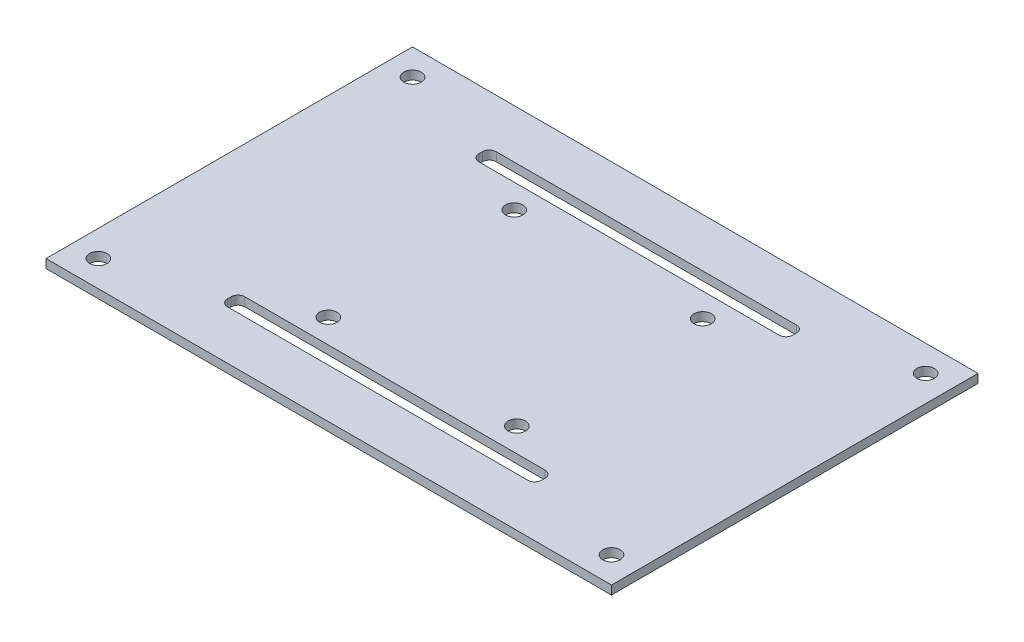
ISO-10303-21;
HEADER;
FILE_DESCRIPTION(('STEP AP214'),'2;1');
FILE_NAME('part.step','',(''),(''),'','','');
FILE_SCHEMA(('AUTOMOTIVE_DESIGN { 1 0 10303 214 1 1 1 1 }'));
ENDSEC;
DATA;
#1=APPLICATION_CONTEXT('core data for automotive mechanical design processes');
#2=APPLICATION_PROTOCOL_DEFINITION('international standard','automotive_design',2000,#1);
#3=PRODUCT_CONTEXT('',#1,'mechanical');
#4=PRODUCT('Part','Part','',(#3));
#5=PRODUCT_RELATED_PRODUCT_CATEGORY('part','',(#4));
#6=PRODUCT_DEFINITION_FORMATION('','',#4);
#7=PRODUCT_DEFINITION_CONTEXT('part definition',#1,'design');
#8=PRODUCT_DEFINITION('design','',#6,#7);
#9=PRODUCT_DEFINITION_SHAPE('','',#8);
#10=(LENGTH_UNIT() NAMED_UNIT(*) SI_UNIT(.MILLI.,.METRE.));
#11=(NAMED_UNIT(*) PLANE_ANGLE_UNIT() SI_UNIT($,.RADIAN.));
#12=(NAMED_UNIT(*) SI_UNIT($,.STERADIAN.) SOLID_ANGLE_UNIT());
#13=UNCERTAINTY_MEASURE_WITH_UNIT(LENGTH_MEASURE(1.E-05),#10,'distance_accuracy_value','');
#14=(GEOMETRIC_REPRESENTATION_CONTEXT(3) GLOBAL_UNCERTAINTY_ASSIGNED_CONTEXT((#13)) GLOBAL_UNIT_ASSIGNED_CONTEXT((#10,
#11,#12)) REPRESENTATION_CONTEXT('',''));
#15=CARTESIAN_POINT('',(0.,0.,0.));
#16=DIRECTION('',(0.,0.,1.));
#17=DIRECTION('',(1.,0.,0.));
#18=AXIS2_PLACEMENT_3D('',#15,#16,#17);
#19=CARTESIAN_POINT('',(-102.87,3.175,66.675));
#20=DIRECTION('',(-1.,0.,0.));
#21=DIRECTION('',(0.,0.,1.));
#22=AXIS2_PLACEMENT_3D('',#19,#20,#21);
#23=PLANE('',#22);
#24=DIRECTION('',(0.,0.,-1.));
#25=VECTOR('',#24,1.);
#26=CARTESIAN_POINT('',(-102.87,0.,66.675));
#27=LINE('',#26,#25);
#28=CARTESIAN_POINT('',(-102.87,0.,66.675));
#29=VERTEX_POINT('',#28);
#30=CARTESIAN_POINT('',(-102.87,0.,-66.675));
#31=VERTEX_POINT('',#30);
#32=EDGE_CURVE('E434',#29,#31,#27,.T.);
#33=ORIENTED_EDGE('',*,*,#32,.F.);
#34=DIRECTION('',(0.,-1.,0.));
#35=VECTOR('',#34,1.);
#36=CARTESIAN_POINT('',(-102.87,3.175,66.675));
#37=LINE('',#36,#35);
#38=CARTESIAN_POINT('',(-102.87,3.175,66.675));
#39=VERTEX_POINT('',#38);
#40=EDGE_CURVE('E11',#39,#29,#37,.T.);
#41=ORIENTED_EDGE('',*,*,#40,.F.);
#42=DIRECTION('',(0.,0.,-1.));
#43=VECTOR('',#42,1.);
#44=CARTESIAN_POINT('',(-102.87,3.175,66.675));
#45=LINE('',#44,#43);
#46=CARTESIAN_POINT('',(-102.87,3.175,-66.675));
#47=VERTEX_POINT('',#46);
#48=EDGE_CURVE('E438',#39,#47,#45,.T.);
#49=ORIENTED_EDGE('',*,*,#48,.T.);
#50=DIRECTION('',(0.,-1.,0.));
#51=VECTOR('',#50,1.);
#52=CARTESIAN_POINT('',(-102.87,3.175,-66.675));
#53=LINE('',#52,#51);
#54=EDGE_CURVE('E56',#47,#31,#53,.T.);
#55=ORIENTED_EDGE('',*,*,#54,.T.);
#56=EDGE_LOOP('',(#33,#41,#49,#55));
#57=FACE_BOUND('',#56,.T.);
#58=ADVANCED_FACE('F53',(#57),#23,.T.);
#59=CARTESIAN_POINT('',(-102.87,3.175,66.675));
#60=DIRECTION('',(0.,0.,-1.));
#61=DIRECTION('',(-1.,0.,0.));
#62=AXIS2_PLACEMENT_3D('',#59,#60,#61);
#63=PLANE('',#62);
#64=DIRECTION('',(1.,0.,0.));
#65=VECTOR('',#64,1.);
#66=CARTESIAN_POINT('',(-102.87,0.,66.675));
#67=LINE('',#66,#65);
#68=CARTESIAN_POINT('',(102.87,0.,66.675));
#69=VERTEX_POINT('',#68);
#70=EDGE_CURVE('E443',#29,#69,#67,.T.);
#71=ORIENTED_EDGE('',*,*,#70,.T.);
#72=DIRECTION('',(0.,-1.,0.));
#73=VECTOR('',#72,1.);
#74=CARTESIAN_POINT('',(102.87,3.175,66.675));
#75=LINE('',#74,#73);
#76=CARTESIAN_POINT('',(102.87,3.175,66.675));
#77=VERTEX_POINT('',#76);
#78=EDGE_CURVE('E62',#77,#69,#75,.T.);
#79=ORIENTED_EDGE('',*,*,#78,.F.);
#80=DIRECTION('',(1.,0.,0.));
#81=VECTOR('',#80,1.);
#82=CARTESIAN_POINT('',(-102.87,3.175,66.675));
#83=LINE('',#82,#81);
#84=EDGE_CURVE('E450',#39,#77,#83,.T.);
#85=ORIENTED_EDGE('',*,*,#84,.F.);
#86=ORIENTED_EDGE('',*,*,#40,.T.);
#87=EDGE_LOOP('',(#71,#79,#85,#86));
#88=FACE_BOUND('',#87,.T.);
#89=ADVANCED_FACE('F486',(#88),#63,.F.);
#90=CARTESIAN_POINT('',(102.87,3.175,66.675));
#91=DIRECTION('',(-1.,0.,0.));
#92=DIRECTION('',(0.,0.,1.));
#93=AXIS2_PLACEMENT_3D('',#90,#91,#92);
#94=PLANE('',#93);
#95=DIRECTION('',(0.,0.,-1.));
#96=VECTOR('',#95,1.);
#97=CARTESIAN_POINT('',(102.87,0.,66.675));
#98=LINE('',#97,#96);
#99=CARTESIAN_POINT('',(102.87,0.,-66.675));
#100=VERTEX_POINT('',#99);
#101=EDGE_CURVE('E460',#69,#100,#98,.T.);
#102=ORIENTED_EDGE('',*,*,#101,.T.);
#103=DIRECTION('',(0.,-1.,0.));
#104=VECTOR('',#103,1.);
#105=CARTESIAN_POINT('',(102.87,3.175,-66.675));
#106=LINE('',#105,#104);
#107=CARTESIAN_POINT('',(102.87,3.175,-66.675));
#108=VERTEX_POINT('',#107);
#109=EDGE_CURVE('E468',#108,#100,#106,.T.);
#110=ORIENTED_EDGE('',*,*,#109,.F.);
#111=DIRECTION('',(0.,0.,-1.));
#112=VECTOR('',#111,1.);
#113=CARTESIAN_POINT('',(102.87,3.175,66.675));
#114=LINE('',#113,#112);
#115=EDGE_CURVE('E447',#77,#108,#114,.T.);
#116=ORIENTED_EDGE('',*,*,#115,.F.);
#117=ORIENTED_EDGE('',*,*,#78,.T.);
#118=EDGE_LOOP('',(#102,#110,#116,#117));
#119=FACE_BOUND('',#118,.T.);
#120=ADVANCED_FACE('F490',(#119),#94,.F.);
#121=CARTESIAN_POINT('',(-102.87,3.175,-66.675));
#122=DIRECTION('',(0.,0.,-1.));
#123=DIRECTION('',(-1.,0.,0.));
#124=AXIS2_PLACEMENT_3D('',#121,#122,#123);
#125=PLANE('',#124);
#126=DIRECTION('',(1.,0.,0.));
#127=VECTOR('',#126,1.);
#128=CARTESIAN_POINT('',(-102.87,0.,-66.675));
#129=LINE('',#128,#127);
#130=EDGE_CURVE('E456',#31,#100,#129,.T.);
#131=ORIENTED_EDGE('',*,*,#130,.F.);
#132=ORIENTED_EDGE('',*,*,#54,.F.);
#133=DIRECTION('',(1.,0.,0.));
#134=VECTOR('',#133,1.);
#135=CARTESIAN_POINT('',(-102.87,3.175,-66.675));
#136=LINE('',#135,#134);
#137=EDGE_CURVE('E442',#47,#108,#136,.T.);
#138=ORIENTED_EDGE('',*,*,#137,.T.);
#139=ORIENTED_EDGE('',*,*,#109,.T.);
#140=EDGE_LOOP('',(#131,#132,#138,#139));
#141=FACE_BOUND('',#140,.T.);
#142=ADVANCED_FACE('F480',(#141),#125,.T.);
#143=CARTESIAN_POINT('',(0.,3.175,0.));
#144=DIRECTION('',(0.,-1.,0.));
#145=DIRECTION('',(0.,0.,-1.));
#146=AXIS2_PLACEMENT_3D('',#143,#144,#145);
#147=PLANE('',#146);
#148=DIRECTION('',(-1.,0.,0.));
#149=VECTOR('',#148,1.);
#150=CARTESIAN_POINT('',(-54.61,3.175,42.545));
#151=LINE('',#150,#149);
#152=CARTESIAN_POINT('',(54.61,3.175,42.545));
#153=VERTEX_POINT('',#152);
#154=CARTESIAN_POINT('',(-54.61,3.175,42.545));
#155=VERTEX_POINT('',#154);
#156=EDGE_CURVE('E245',#153,#155,#151,.T.);
#157=ORIENTED_EDGE('',*,*,#156,.F.);
#158=CARTESIAN_POINT('',(54.61,3.175,45.085));
#159=DIRECTION('',(0.,1.,0.));
#160=DIRECTION('',(0.,0.,-1.));
#161=AXIS2_PLACEMENT_3D('',#158,#159,#160);
#162=CIRCLE('',#161,2.54);
#163=CARTESIAN_POINT('',(57.15,3.175,45.085));
#164=VERTEX_POINT('',#163);
#165=EDGE_CURVE('E70',#164,#153,#162,.T.);
#166=ORIENTED_EDGE('',*,*,#165,.F.);
#167=DIRECTION('',(0.,0.,-1.));
#168=VECTOR('',#167,1.);
#169=CARTESIAN_POINT('',(57.15,3.175,45.085));
#170=LINE('',#169,#168);
#171=CARTESIAN_POINT('',(57.15,3.175,46.355));
#172=VERTEX_POINT('',#171);
#173=EDGE_CURVE('E216',#172,#164,#170,.T.);
#174=ORIENTED_EDGE('',*,*,#173,.F.);
#175=CARTESIAN_POINT('',(54.61,3.175,46.355));
#176=DIRECTION('',(0.,1.,0.));
#177=DIRECTION('',(0.,0.,1.));
#178=AXIS2_PLACEMENT_3D('',#175,#176,#177);
#179=CIRCLE('',#178,2.54);
#180=CARTESIAN_POINT('',(54.61,3.175,48.895));
#181=VERTEX_POINT('',#180);
#182=EDGE_CURVE('E221',#181,#172,#179,.T.);
#183=ORIENTED_EDGE('',*,*,#182,.F.);
#184=DIRECTION('',(1.,0.,0.));
#185=VECTOR('',#184,1.);
#186=CARTESIAN_POINT('',(-54.61,3.175,48.895));
#187=LINE('',#186,#185);
#188=CARTESIAN_POINT('',(-54.61,3.175,48.895));
#189=VERTEX_POINT('',#188);
#190=EDGE_CURVE('E260',#189,#181,#187,.T.);
#191=ORIENTED_EDGE('',*,*,#190,.F.);
#192=CARTESIAN_POINT('',(-54.61,3.175,46.355));
#193=DIRECTION('',(0.,1.,0.));
#194=DIRECTION('',(0.,0.,1.));
#195=AXIS2_PLACEMENT_3D('',#192,#193,#194);
#196=CIRCLE('',#195,2.54);
#197=CARTESIAN_POINT('',(-57.15,3.175,46.355));
#198=VERTEX_POINT('',#197);
#199=EDGE_CURVE('E256',#198,#189,#196,.T.);
#200=ORIENTED_EDGE('',*,*,#199,.F.);
#201=DIRECTION('',(0.,0.,1.));
#202=VECTOR('',#201,1.);
#203=CARTESIAN_POINT('',(-57.15,3.175,45.085));
#204=LINE('',#203,#202);
#205=CARTESIAN_POINT('',(-57.15,3.175,45.085));
#206=VERTEX_POINT('',#205);
#207=EDGE_CURVE('E252',#206,#198,#204,.T.);
#208=ORIENTED_EDGE('',*,*,#207,.F.);
#209=CARTESIAN_POINT('',(-54.61,3.175,45.085));
#210=DIRECTION('',(0.,1.,0.));
#211=DIRECTION('',(0.,0.,1.));
#212=AXIS2_PLACEMENT_3D('',#209,#210,#211);
#213=CIRCLE('',#212,2.54);
#214=EDGE_CURVE('E248',#155,#206,#213,.T.);
#215=ORIENTED_EDGE('',*,*,#214,.F.);
#216=EDGE_LOOP('',(#157,#166,#174,#183,#191,#200,#208,#215));
#217=FACE_BOUND('',#216,.T.);
#218=DIRECTION('',(1.,0.,0.));
#219=VECTOR('',#218,1.);
#220=CARTESIAN_POINT('',(-54.61,3.175,-42.545));
#221=LINE('',#220,#219);
#222=CARTESIAN_POINT('',(-54.61,3.175,-42.545));
#223=VERTEX_POINT('',#222);
#224=CARTESIAN_POINT('',(54.61,3.175,-42.545));
#225=VERTEX_POINT('',#224);
#226=EDGE_CURVE('E338',#223,#225,#221,.T.);
#227=ORIENTED_EDGE('',*,*,#226,.F.);
#228=CARTESIAN_POINT('',(-54.61,3.175,-45.085));
#229=DIRECTION('',(0.,1.,0.));
#230=DIRECTION('',(0.,0.,-1.));
#231=AXIS2_PLACEMENT_3D('',#228,#229,#230);
#232=CIRCLE('',#231,2.54);
#233=CARTESIAN_POINT('',(-57.15,3.175,-45.085));
#234=VERTEX_POINT('',#233);
#235=EDGE_CURVE('E78',#234,#223,#232,.T.);
#236=ORIENTED_EDGE('',*,*,#235,.F.);
#237=DIRECTION('',(0.,0.,1.));
#238=VECTOR('',#237,1.);
#239=CARTESIAN_POINT('',(-57.15,3.175,-45.085));
#240=LINE('',#239,#238);
#241=CARTESIAN_POINT('',(-57.15,3.175,-46.355));
#242=VERTEX_POINT('',#241);
#243=EDGE_CURVE('E313',#242,#234,#240,.T.);
#244=ORIENTED_EDGE('',*,*,#243,.F.);
#245=CARTESIAN_POINT('',(-54.61,3.175,-46.355));
#246=DIRECTION('',(0.,1.,0.));
#247=DIRECTION('',(0.,0.,-1.));
#248=AXIS2_PLACEMENT_3D('',#245,#246,#247);
#249=CIRCLE('',#248,2.54);
#250=CARTESIAN_POINT('',(-54.61,3.175,-48.895));
#251=VERTEX_POINT('',#250);
#252=EDGE_CURVE('E317',#251,#242,#249,.T.);
#253=ORIENTED_EDGE('',*,*,#252,.F.);
#254=DIRECTION('',(-1.,0.,0.));
#255=VECTOR('',#254,1.);
#256=CARTESIAN_POINT('',(-54.61,3.175,-48.895));
#257=LINE('',#256,#255);
#258=CARTESIAN_POINT('',(54.61,3.175,-48.895));
#259=VERTEX_POINT('',#258);
#260=EDGE_CURVE('E322',#259,#251,#257,.T.);
#261=ORIENTED_EDGE('',*,*,#260,.F.);
#262=CARTESIAN_POINT('',(54.61,3.175,-46.355));
#263=DIRECTION('',(0.,1.,0.));
#264=DIRECTION('',(0.,0.,-1.));
#265=AXIS2_PLACEMENT_3D('',#262,#263,#264);
#266=CIRCLE('',#265,2.54);
#267=CARTESIAN_POINT('',(57.15,3.175,-46.355));
#268=VERTEX_POINT('',#267);
#269=EDGE_CURVE('E326',#268,#259,#266,.T.);
#270=ORIENTED_EDGE('',*,*,#269,.F.);
#271=DIRECTION('',(0.,0.,-1.));
#272=VECTOR('',#271,1.);
#273=CARTESIAN_POINT('',(57.15,3.175,-45.085));
#274=LINE('',#273,#272);
#275=CARTESIAN_POINT('',(57.15,3.175,-45.085));
#276=VERTEX_POINT('',#275);
#277=EDGE_CURVE('E330',#276,#268,#274,.T.);
#278=ORIENTED_EDGE('',*,*,#277,.F.);
#279=CARTESIAN_POINT('',(54.61,3.175,-45.085));
#280=DIRECTION('',(0.,1.,0.));
#281=DIRECTION('',(0.,0.,1.));
#282=AXIS2_PLACEMENT_3D('',#279,#280,#281);
#283=CIRCLE('',#282,2.54);
#284=EDGE_CURVE('E334',#225,#276,#283,.T.);
#285=ORIENTED_EDGE('',*,*,#284,.F.);
#286=EDGE_LOOP('',(#227,#236,#244,#253,#261,#270,#278,#285));
#287=FACE_BOUND('',#286,.T.);
#288=CARTESIAN_POINT('',(-93.345,3.175,57.15));
#289=DIRECTION('',(0.,1.,0.));
#290=DIRECTION('',(0.,0.,-1.));
#291=AXIS2_PLACEMENT_3D('',#288,#289,#290);
#292=CIRCLE('',#291,3.175);
#293=CARTESIAN_POINT('',(-93.345,3.175,53.975));
#294=VERTEX_POINT('',#293);
#295=EDGE_CURVE('E391',#294,#294,#292,.T.);
#296=ORIENTED_EDGE('',*,*,#295,.F.);
#297=EDGE_LOOP('',(#296));
#298=FACE_BOUND('',#297,.T.);
#299=CARTESIAN_POINT('',(93.345,3.175,57.15));
#300=DIRECTION('',(0.,1.,0.));
#301=DIRECTION('',(0.,0.,-1.));
#302=AXIS2_PLACEMENT_3D('',#299,#300,#301);
#303=CIRCLE('',#302,3.175);
#304=CARTESIAN_POINT('',(93.345,3.175,53.975));
#305=VERTEX_POINT('',#304);
#306=EDGE_CURVE('E383',#305,#305,#303,.T.);
#307=ORIENTED_EDGE('',*,*,#306,.F.);
#308=EDGE_LOOP('',(#307));
#309=FACE_BOUND('',#308,.T.);
#310=CARTESIAN_POINT('',(93.345,3.175,-57.15));
#311=DIRECTION('',(0.,1.,0.));
#312=DIRECTION('',(0.,0.,1.));
#313=AXIS2_PLACEMENT_3D('',#310,#311,#312);
#314=CIRCLE('',#313,3.175);
#315=CARTESIAN_POINT('',(93.345,3.175,-53.975));
#316=VERTEX_POINT('',#315);
#317=EDGE_CURVE('E374',#316,#316,#314,.T.);
#318=ORIENTED_EDGE('',*,*,#317,.F.);
#319=EDGE_LOOP('',(#318));
#320=FACE_BOUND('',#319,.T.);
#321=CARTESIAN_POINT('',(-93.345,3.175,-57.15));
#322=DIRECTION('',(0.,1.,0.));
#323=DIRECTION('',(0.,0.,1.));
#324=AXIS2_PLACEMENT_3D('',#321,#322,#323);
#325=CIRCLE('',#324,3.175);
#326=CARTESIAN_POINT('',(-93.345,3.175,-53.975));
#327=VERTEX_POINT('',#326);
#328=EDGE_CURVE('E378',#327,#327,#325,.T.);
#329=ORIENTED_EDGE('',*,*,#328,.F.);
#330=EDGE_LOOP('',(#329));
#331=FACE_BOUND('',#330,.T.);
#332=CARTESIAN_POINT('',(-33.02,3.175,-33.812500066));
#333=DIRECTION('',(0.,1.,0.));
#334=DIRECTION('',(0.,0.,1.));
#335=AXIS2_PLACEMENT_3D('',#332,#333,#334);
#336=CIRCLE('',#335,3.175);
#337=CARTESIAN_POINT('',(-33.02,3.175,-30.637500066));
#338=VERTEX_POINT('',#337);
#339=EDGE_CURVE('E423',#338,#338,#336,.T.);
#340=ORIENTED_EDGE('',*,*,#339,.F.);
#341=EDGE_LOOP('',(#340));
#342=FACE_BOUND('',#341,.T.);
#343=CARTESIAN_POINT('',(35.56,3.175,-33.812500066));
#344=DIRECTION('',(0.,1.,0.));
#345=DIRECTION('',(0.,0.,1.));
#346=AXIS2_PLACEMENT_3D('',#343,#344,#345);
#347=CIRCLE('',#346,3.175);
#348=CARTESIAN_POINT('',(35.56,3.175,-30.637500066));
#349=VERTEX_POINT('',#348);
#350=EDGE_CURVE('E415',#349,#349,#347,.T.);
#351=ORIENTED_EDGE('',*,*,#350,.F.);
#352=EDGE_LOOP('',(#351));
#353=FACE_BOUND('',#352,.T.);
#354=CARTESIAN_POINT('',(35.56,3.175,33.812500066));
#355=DIRECTION('',(0.,1.,0.));
#356=DIRECTION('',(0.,0.,1.));
#357=AXIS2_PLACEMENT_3D('',#354,#355,#356);
#358=CIRCLE('',#357,3.175);
#359=CARTESIAN_POINT('',(35.56,3.175,36.987500066));
#360=VERTEX_POINT('',#359);
#361=EDGE_CURVE('E406',#360,#360,#358,.T.);
#362=ORIENTED_EDGE('',*,*,#361,.F.);
#363=EDGE_LOOP('',(#362));
#364=FACE_BOUND('',#363,.T.);
#365=CARTESIAN_POINT('',(-33.02,3.175,33.812500066));
#366=DIRECTION('',(0.,1.,0.));
#367=DIRECTION('',(0.,0.,1.));
#368=AXIS2_PLACEMENT_3D('',#365,#366,#367);
#369=CIRCLE('',#368,3.175);
#370=CARTESIAN_POINT('',(-33.02,3.175,36.987500066));
#371=VERTEX_POINT('',#370);
#372=EDGE_CURVE('E410',#371,#371,#369,.T.);
#373=ORIENTED_EDGE('',*,*,#372,.F.);
#374=EDGE_LOOP('',(#373));
#375=FACE_BOUND('',#374,.T.);
#376=ORIENTED_EDGE('',*,*,#48,.F.);
#377=ORIENTED_EDGE('',*,*,#84,.T.);
#378=ORIENTED_EDGE('',*,*,#115,.T.);
#379=ORIENTED_EDGE('',*,*,#137,.F.);
#380=EDGE_LOOP('',(#376,#377,#378,#379));
#381=FACE_BOUND('',#380,.T.);
#382=ADVANCED_FACE('F492',(#217,#287,#298,#309,#320,#331,#342,#353,#364,#375,#381),#147,.F.);
#383=CARTESIAN_POINT('',(0.,0.,0.));
#384=DIRECTION('',(0.,-1.,0.));
#385=DIRECTION('',(0.,0.,-1.));
#386=AXIS2_PLACEMENT_3D('',#383,#384,#385);
#387=PLANE('',#386);
#388=CARTESIAN_POINT('',(54.61,0.,45.085));
#389=DIRECTION('',(0.,1.,0.));
#390=DIRECTION('',(0.,0.,-1.));
#391=AXIS2_PLACEMENT_3D('',#388,#389,#390);
#392=CIRCLE('',#391,2.54);
#393=CARTESIAN_POINT('',(57.15,0.,45.085));
#394=VERTEX_POINT('',#393);
#395=CARTESIAN_POINT('',(54.61,0.,42.545));
#396=VERTEX_POINT('',#395);
#397=EDGE_CURVE('E193',#394,#396,#392,.T.);
#398=ORIENTED_EDGE('',*,*,#397,.T.);
#399=DIRECTION('',(-1.,0.,0.));
#400=VECTOR('',#399,1.);
#401=CARTESIAN_POINT('',(-54.61,0.,42.545));
#402=LINE('',#401,#400);
#403=CARTESIAN_POINT('',(-54.61,0.,42.545));
#404=VERTEX_POINT('',#403);
#405=EDGE_CURVE('E204',#396,#404,#402,.T.);
#406=ORIENTED_EDGE('',*,*,#405,.T.);
#407=CARTESIAN_POINT('',(-54.61,0.,45.085));
#408=DIRECTION('',(0.,1.,0.));
#409=DIRECTION('',(0.,0.,1.));
#410=AXIS2_PLACEMENT_3D('',#407,#408,#409);
#411=CIRCLE('',#410,2.54);
#412=CARTESIAN_POINT('',(-57.15,0.,45.085));
#413=VERTEX_POINT('',#412);
#414=EDGE_CURVE('E209',#404,#413,#411,.T.);
#415=ORIENTED_EDGE('',*,*,#414,.T.);
#416=DIRECTION('',(0.,0.,1.));
#417=VECTOR('',#416,1.);
#418=CARTESIAN_POINT('',(-57.15,0.,45.085));
#419=LINE('',#418,#417);
#420=CARTESIAN_POINT('',(-57.15,0.,46.355));
#421=VERTEX_POINT('',#420);
#422=EDGE_CURVE('E226',#413,#421,#419,.T.);
#423=ORIENTED_EDGE('',*,*,#422,.T.);
#424=CARTESIAN_POINT('',(-54.61,0.,46.355));
#425=DIRECTION('',(0.,1.,0.));
#426=DIRECTION('',(0.,0.,1.));
#427=AXIS2_PLACEMENT_3D('',#424,#425,#426);
#428=CIRCLE('',#427,2.54);
#429=CARTESIAN_POINT('',(-54.61,0.,48.895));
#430=VERTEX_POINT('',#429);
#431=EDGE_CURVE('E230',#421,#430,#428,.T.);
#432=ORIENTED_EDGE('',*,*,#431,.T.);
#433=DIRECTION('',(1.,0.,0.));
#434=VECTOR('',#433,1.);
#435=CARTESIAN_POINT('',(-54.61,0.,48.895));
#436=LINE('',#435,#434);
#437=CARTESIAN_POINT('',(54.61,0.,48.895));
#438=VERTEX_POINT('',#437);
#439=EDGE_CURVE('E234',#430,#438,#436,.T.);
#440=ORIENTED_EDGE('',*,*,#439,.T.);
#441=CARTESIAN_POINT('',(54.61,0.,46.355));
#442=DIRECTION('',(0.,1.,0.));
#443=DIRECTION('',(0.,0.,1.));
#444=AXIS2_PLACEMENT_3D('',#441,#442,#443);
#445=CIRCLE('',#444,2.54);
#446=CARTESIAN_POINT('',(57.15,0.,46.355));
#447=VERTEX_POINT('',#446);
#448=EDGE_CURVE('E238',#438,#447,#445,.T.);
#449=ORIENTED_EDGE('',*,*,#448,.T.);
#450=DIRECTION('',(0.,0.,-1.));
#451=VECTOR('',#450,1.);
#452=CARTESIAN_POINT('',(57.15,0.,45.085));
#453=LINE('',#452,#451);
#454=EDGE_CURVE('E200',#447,#394,#453,.T.);
#455=ORIENTED_EDGE('',*,*,#454,.T.);
#456=EDGE_LOOP('',(#398,#406,#415,#423,#432,#440,#449,#455));
#457=FACE_BOUND('',#456,.T.);
#458=CARTESIAN_POINT('',(-54.61,0.,-45.085));
#459=DIRECTION('',(0.,1.,0.));
#460=DIRECTION('',(0.,0.,-1.));
#461=AXIS2_PLACEMENT_3D('',#458,#459,#460);
#462=CIRCLE('',#461,2.54);
#463=CARTESIAN_POINT('',(-57.15,0.,-45.085));
#464=VERTEX_POINT('',#463);
#465=CARTESIAN_POINT('',(-54.61,0.,-42.545));
#466=VERTEX_POINT('',#465);
#467=EDGE_CURVE('E318',#464,#466,#462,.T.);
#468=ORIENTED_EDGE('',*,*,#467,.T.);
#469=DIRECTION('',(1.,0.,0.));
#470=VECTOR('',#469,1.);
#471=CARTESIAN_POINT('',(-54.61,0.,-42.545));
#472=LINE('',#471,#470);
#473=CARTESIAN_POINT('',(54.61,0.,-42.545));
#474=VERTEX_POINT('',#473);
#475=EDGE_CURVE('E367',#466,#474,#472,.T.);
#476=ORIENTED_EDGE('',*,*,#475,.T.);
#477=CARTESIAN_POINT('',(54.61,0.,-45.085));
#478=DIRECTION('',(0.,1.,0.));
#479=DIRECTION('',(0.,0.,1.));
#480=AXIS2_PLACEMENT_3D('',#477,#478,#479);
#481=CIRCLE('',#480,2.54);
#482=CARTESIAN_POINT('',(57.15,0.,-45.085));
#483=VERTEX_POINT('',#482);
#484=EDGE_CURVE('E363',#474,#483,#481,.T.);
#485=ORIENTED_EDGE('',*,*,#484,.T.);
#486=DIRECTION('',(0.,0.,-1.));
#487=VECTOR('',#486,1.);
#488=CARTESIAN_POINT('',(57.15,0.,-45.085));
#489=LINE('',#488,#487);
#490=CARTESIAN_POINT('',(57.15,0.,-46.355));
#491=VERTEX_POINT('',#490);
#492=EDGE_CURVE('E359',#483,#491,#489,.T.);
#493=ORIENTED_EDGE('',*,*,#492,.T.);
#494=CARTESIAN_POINT('',(54.61,0.,-46.355));
#495=DIRECTION('',(0.,1.,0.));
#496=DIRECTION('',(0.,0.,-1.));
#497=AXIS2_PLACEMENT_3D('',#494,#495,#496);
#498=CIRCLE('',#497,2.54);
#499=CARTESIAN_POINT('',(54.61,0.,-48.895));
#500=VERTEX_POINT('',#499);
#501=EDGE_CURVE('E355',#491,#500,#498,.T.);
#502=ORIENTED_EDGE('',*,*,#501,.T.);
#503=DIRECTION('',(-1.,0.,0.));
#504=VECTOR('',#503,1.);
#505=CARTESIAN_POINT('',(-54.61,0.,-48.895));
#506=LINE('',#505,#504);
#507=CARTESIAN_POINT('',(-54.61,0.,-48.895));
#508=VERTEX_POINT('',#507);
#509=EDGE_CURVE('E351',#500,#508,#506,.T.);
#510=ORIENTED_EDGE('',*,*,#509,.T.);
#511=CARTESIAN_POINT('',(-54.61,0.,-46.355));
#512=DIRECTION('',(0.,1.,0.));
#513=DIRECTION('',(0.,0.,-1.));
#514=AXIS2_PLACEMENT_3D('',#511,#512,#513);
#515=CIRCLE('',#514,2.54);
#516=CARTESIAN_POINT('',(-57.15,0.,-46.355));
#517=VERTEX_POINT('',#516);
#518=EDGE_CURVE('E347',#508,#517,#515,.T.);
#519=ORIENTED_EDGE('',*,*,#518,.T.);
#520=DIRECTION('',(0.,0.,1.));
#521=VECTOR('',#520,1.);
#522=CARTESIAN_POINT('',(-57.15,0.,-45.085));
#523=LINE('',#522,#521);
#524=EDGE_CURVE('E291',#517,#464,#523,.T.);
#525=ORIENTED_EDGE('',*,*,#524,.T.);
#526=EDGE_LOOP('',(#468,#476,#485,#493,#502,#510,#519,#525));
#527=FACE_BOUND('',#526,.T.);
#528=CARTESIAN_POINT('',(-93.345,0.,57.15));
#529=DIRECTION('',(0.,1.,0.));
#530=DIRECTION('',(0.,0.,-1.));
#531=AXIS2_PLACEMENT_3D('',#528,#529,#530);
#532=CIRCLE('',#531,3.175);
#533=CARTESIAN_POINT('',(-93.345,0.,53.975));
#534=VERTEX_POINT('',#533);
#535=EDGE_CURVE('E270',#534,#534,#532,.T.);
#536=ORIENTED_EDGE('',*,*,#535,.T.);
#537=EDGE_LOOP('',(#536));
#538=FACE_BOUND('',#537,.T.);
#539=CARTESIAN_POINT('',(93.345,0.,57.15));
#540=DIRECTION('',(0.,1.,0.));
#541=DIRECTION('',(0.,0.,-1.));
#542=AXIS2_PLACEMENT_3D('',#539,#540,#541);
#543=CIRCLE('',#542,3.175);
#544=CARTESIAN_POINT('',(93.345,0.,53.975));
#545=VERTEX_POINT('',#544);
#546=EDGE_CURVE('E387',#545,#545,#543,.T.);
#547=ORIENTED_EDGE('',*,*,#546,.T.);
#548=EDGE_LOOP('',(#547));
#549=FACE_BOUND('',#548,.T.);
#550=CARTESIAN_POINT('',(93.345,0.,-57.15));
#551=DIRECTION('',(0.,1.,0.));
#552=DIRECTION('',(0.,0.,1.));
#553=AXIS2_PLACEMENT_3D('',#550,#551,#552);
#554=CIRCLE('',#553,3.175);
#555=CARTESIAN_POINT('',(93.345,0.,-53.975));
#556=VERTEX_POINT('',#555);
#557=EDGE_CURVE('E379',#556,#556,#554,.T.);
#558=ORIENTED_EDGE('',*,*,#557,.T.);
#559=EDGE_LOOP('',(#558));
#560=FACE_BOUND('',#559,.T.);
#561=CARTESIAN_POINT('',(-93.345,0.,-57.15));
#562=DIRECTION('',(0.,1.,0.));
#563=DIRECTION('',(0.,0.,1.));
#564=AXIS2_PLACEMENT_3D('',#561,#562,#563);
#565=CIRCLE('',#564,3.175);
#566=CARTESIAN_POINT('',(-93.345,0.,-53.975));
#567=VERTEX_POINT('',#566);
#568=EDGE_CURVE('E398',#567,#567,#565,.T.);
#569=ORIENTED_EDGE('',*,*,#568,.T.);
#570=EDGE_LOOP('',(#569));
#571=FACE_BOUND('',#570,.T.);
#572=CARTESIAN_POINT('',(-33.02,0.,-33.812500066));
#573=DIRECTION('',(0.,1.,0.));
#574=DIRECTION('',(0.,0.,1.));
#575=AXIS2_PLACEMENT_3D('',#572,#573,#574);
#576=CIRCLE('',#575,3.175);
#577=CARTESIAN_POINT('',(-33.02,0.,-30.637500066));
#578=VERTEX_POINT('',#577);
#579=EDGE_CURVE('E402',#578,#578,#576,.T.);
#580=ORIENTED_EDGE('',*,*,#579,.T.);
#581=EDGE_LOOP('',(#580));
#582=FACE_BOUND('',#581,.T.);
#583=CARTESIAN_POINT('',(35.56,0.,-33.812500066));
#584=DIRECTION('',(0.,1.,0.));
#585=DIRECTION('',(0.,0.,1.));
#586=AXIS2_PLACEMENT_3D('',#583,#584,#585);
#587=CIRCLE('',#586,3.175);
#588=CARTESIAN_POINT('',(35.56,0.,-30.637500066));
#589=VERTEX_POINT('',#588);
#590=EDGE_CURVE('E419',#589,#589,#587,.T.);
#591=ORIENTED_EDGE('',*,*,#590,.T.);
#592=EDGE_LOOP('',(#591));
#593=FACE_BOUND('',#592,.T.);
#594=CARTESIAN_POINT('',(35.56,0.,33.812500066));
#595=DIRECTION('',(0.,1.,0.));
#596=DIRECTION('',(0.,0.,1.));
#597=AXIS2_PLACEMENT_3D('',#594,#595,#596);
#598=CIRCLE('',#597,3.175);
#599=CARTESIAN_POINT('',(35.56,0.,36.987500066));
#600=VERTEX_POINT('',#599);
#601=EDGE_CURVE('E411',#600,#600,#598,.T.);
#602=ORIENTED_EDGE('',*,*,#601,.T.);
#603=EDGE_LOOP('',(#602));
#604=FACE_BOUND('',#603,.T.);
#605=CARTESIAN_POINT('',(-33.02,0.,33.812500066));
#606=DIRECTION('',(0.,1.,0.));
#607=DIRECTION('',(0.,0.,1.));
#608=AXIS2_PLACEMENT_3D('',#605,#606,#607);
#609=CIRCLE('',#608,3.175);
#610=CARTESIAN_POINT('',(-33.02,0.,36.987500066));
#611=VERTEX_POINT('',#610);
#612=EDGE_CURVE('E430',#611,#611,#609,.T.);
#613=ORIENTED_EDGE('',*,*,#612,.T.);
#614=EDGE_LOOP('',(#613));
#615=FACE_BOUND('',#614,.T.);
#616=ORIENTED_EDGE('',*,*,#32,.T.);
#617=ORIENTED_EDGE('',*,*,#130,.T.);
#618=ORIENTED_EDGE('',*,*,#101,.F.);
#619=ORIENTED_EDGE('',*,*,#70,.F.);
#620=EDGE_LOOP('',(#616,#617,#618,#619));
#621=FACE_BOUND('',#620,.T.);
#622=ADVANCED_FACE('F211',(#457,#527,#538,#549,#560,#571,#582,#593,#604,#615,#621),#387,.T.);
#623=CARTESIAN_POINT('',(-33.02,0.,33.812500066));
#624=DIRECTION('',(0.,1.,0.));
#625=DIRECTION('',(0.,0.,1.));
#626=AXIS2_PLACEMENT_3D('',#623,#624,#625);
#627=CYLINDRICAL_SURFACE('',#626,3.175);
#628=ORIENTED_EDGE('',*,*,#612,.F.);
#629=EDGE_LOOP('',(#628));
#630=FACE_BOUND('',#629,.T.);
#631=ORIENTED_EDGE('',*,*,#372,.T.);
#632=EDGE_LOOP('',(#631));
#633=FACE_BOUND('',#632,.T.);
#634=ADVANCED_FACE('F500',(#630,#633),#627,.F.);
#635=CARTESIAN_POINT('',(35.56,0.,33.812500066));
#636=DIRECTION('',(0.,1.,0.));
#637=DIRECTION('',(0.,0.,1.));
#638=AXIS2_PLACEMENT_3D('',#635,#636,#637);
#639=CYLINDRICAL_SURFACE('',#638,3.175);
#640=ORIENTED_EDGE('',*,*,#601,.F.);
#641=EDGE_LOOP('',(#640));
#642=FACE_BOUND('',#641,.T.);
#643=ORIENTED_EDGE('',*,*,#361,.T.);
#644=EDGE_LOOP('',(#643));
#645=FACE_BOUND('',#644,.T.);
#646=ADVANCED_FACE('F744',(#642,#645),#639,.F.);
#647=CARTESIAN_POINT('',(35.56,0.,-33.812500066));
#648=DIRECTION('',(0.,1.,0.));
#649=DIRECTION('',(0.,0.,1.));
#650=AXIS2_PLACEMENT_3D('',#647,#648,#649);
#651=CYLINDRICAL_SURFACE('',#650,3.175);
#652=ORIENTED_EDGE('',*,*,#590,.F.);
#653=EDGE_LOOP('',(#652));
#654=FACE_BOUND('',#653,.T.);
#655=ORIENTED_EDGE('',*,*,#350,.T.);
#656=EDGE_LOOP('',(#655));
#657=FACE_BOUND('',#656,.T.);
#658=ADVANCED_FACE('F735',(#654,#657),#651,.F.);
#659=CARTESIAN_POINT('',(-33.02,0.,-33.812500066));
#660=DIRECTION('',(0.,1.,0.));
#661=DIRECTION('',(0.,0.,1.));
#662=AXIS2_PLACEMENT_3D('',#659,#660,#661);
#663=CYLINDRICAL_SURFACE('',#662,3.175);
#664=ORIENTED_EDGE('',*,*,#579,.F.);
#665=EDGE_LOOP('',(#664));
#666=FACE_BOUND('',#665,.T.);
#667=ORIENTED_EDGE('',*,*,#339,.T.);
#668=EDGE_LOOP('',(#667));
#669=FACE_BOUND('',#668,.T.);
#670=ADVANCED_FACE('F726',(#666,#669),#663,.F.);
#671=CARTESIAN_POINT('',(-93.345,0.,-57.15));
#672=DIRECTION('',(0.,1.,0.));
#673=DIRECTION('',(0.,0.,1.));
#674=AXIS2_PLACEMENT_3D('',#671,#672,#673);
#675=CYLINDRICAL_SURFACE('',#674,3.175);
#676=ORIENTED_EDGE('',*,*,#568,.F.);
#677=EDGE_LOOP('',(#676));
#678=FACE_BOUND('',#677,.T.);
#679=ORIENTED_EDGE('',*,*,#328,.T.);
#680=EDGE_LOOP('',(#679));
#681=FACE_BOUND('',#680,.T.);
#682=ADVANCED_FACE('F717',(#678,#681),#675,.F.);
#683=CARTESIAN_POINT('',(93.345,0.,-57.15));
#684=DIRECTION('',(0.,1.,0.));
#685=DIRECTION('',(0.,0.,1.));
#686=AXIS2_PLACEMENT_3D('',#683,#684,#685);
#687=CYLINDRICAL_SURFACE('',#686,3.175);
#688=ORIENTED_EDGE('',*,*,#557,.F.);
#689=EDGE_LOOP('',(#688));
#690=FACE_BOUND('',#689,.T.);
#691=ORIENTED_EDGE('',*,*,#317,.T.);
#692=EDGE_LOOP('',(#691));
#693=FACE_BOUND('',#692,.T.);
#694=ADVANCED_FACE('F708',(#690,#693),#687,.F.);
#695=CARTESIAN_POINT('',(93.345,0.,57.15));
#696=DIRECTION('',(0.,1.,0.));
#697=DIRECTION('',(0.,0.,1.));
#698=AXIS2_PLACEMENT_3D('',#695,#696,#697);
#699=CYLINDRICAL_SURFACE('',#698,3.175);
#700=ORIENTED_EDGE('',*,*,#546,.F.);
#701=EDGE_LOOP('',(#700));
#702=FACE_BOUND('',#701,.T.);
#703=ORIENTED_EDGE('',*,*,#306,.T.);
#704=EDGE_LOOP('',(#703));
#705=FACE_BOUND('',#704,.T.);
#706=ADVANCED_FACE('F699',(#702,#705),#699,.F.);
#707=CARTESIAN_POINT('',(-93.345,0.,57.15));
#708=DIRECTION('',(0.,1.,0.));
#709=DIRECTION('',(0.,0.,1.));
#710=AXIS2_PLACEMENT_3D('',#707,#708,#709);
#711=CYLINDRICAL_SURFACE('',#710,3.175);
#712=ORIENTED_EDGE('',*,*,#535,.F.);
#713=EDGE_LOOP('',(#712));
#714=FACE_BOUND('',#713,.T.);
#715=ORIENTED_EDGE('',*,*,#295,.T.);
#716=EDGE_LOOP('',(#715));
#717=FACE_BOUND('',#716,.T.);
#718=ADVANCED_FACE('F545',(#714,#717),#711,.F.);
#719=CARTESIAN_POINT('',(-54.61,0.,-45.085));
#720=DIRECTION('',(0.,1.,0.));
#721=DIRECTION('',(0.,0.,1.));
#722=AXIS2_PLACEMENT_3D('',#719,#720,#721);
#723=CYLINDRICAL_SURFACE('',#722,2.54);
#724=ORIENTED_EDGE('',*,*,#235,.T.);
#725=DIRECTION('',(0.,1.,0.));
#726=VECTOR('',#725,1.);
#727=CARTESIAN_POINT('',(-54.61,0.,-42.545));
#728=LINE('',#727,#726);
#729=EDGE_CURVE('E288',#466,#223,#728,.T.);
#730=ORIENTED_EDGE('',*,*,#729,.F.);
#731=ORIENTED_EDGE('',*,*,#467,.F.);
#732=DIRECTION('',(0.,1.,0.));
#733=VECTOR('',#732,1.);
#734=CARTESIAN_POINT('',(-57.15,0.,-45.085));
#735=LINE('',#734,#733);
#736=EDGE_CURVE('E310',#464,#234,#735,.T.);
#737=ORIENTED_EDGE('',*,*,#736,.T.);
#738=EDGE_LOOP('',(#724,#730,#731,#737));
#739=FACE_BOUND('',#738,.T.);
#740=ADVANCED_FACE('F540',(#739),#723,.F.);
#741=CARTESIAN_POINT('',(-57.15,0.,-45.085));
#742=DIRECTION('',(-1.,0.,0.));
#743=DIRECTION('',(0.,0.,1.));
#744=AXIS2_PLACEMENT_3D('',#741,#742,#743);
#745=PLANE('',#744);
#746=ORIENTED_EDGE('',*,*,#243,.T.);
#747=ORIENTED_EDGE('',*,*,#736,.F.);
#748=ORIENTED_EDGE('',*,*,#524,.F.);
#749=DIRECTION('',(0.,1.,0.));
#750=VECTOR('',#749,1.);
#751=CARTESIAN_POINT('',(-57.15,0.,-46.355));
#752=LINE('',#751,#750);
#753=EDGE_CURVE('E307',#517,#242,#752,.T.);
#754=ORIENTED_EDGE('',*,*,#753,.T.);
#755=EDGE_LOOP('',(#746,#747,#748,#754));
#756=FACE_BOUND('',#755,.T.);
#757=ADVANCED_FACE('F544',(#756),#745,.F.);
#758=CARTESIAN_POINT('',(-54.61,0.,-46.355));
#759=DIRECTION('',(0.,1.,0.));
#760=DIRECTION('',(0.,0.,1.));
#761=AXIS2_PLACEMENT_3D('',#758,#759,#760);
#762=CYLINDRICAL_SURFACE('',#761,2.54);
#763=ORIENTED_EDGE('',*,*,#252,.T.);
#764=ORIENTED_EDGE('',*,*,#753,.F.);
#765=ORIENTED_EDGE('',*,*,#518,.F.);
#766=DIRECTION('',(0.,1.,0.));
#767=VECTOR('',#766,1.);
#768=CARTESIAN_POINT('',(-54.61,0.,-48.895));
#769=LINE('',#768,#767);
#770=EDGE_CURVE('E304',#508,#251,#769,.T.);
#771=ORIENTED_EDGE('',*,*,#770,.T.);
#772=EDGE_LOOP('',(#763,#764,#765,#771));
#773=FACE_BOUND('',#772,.T.);
#774=ADVANCED_FACE('F554',(#773),#762,.F.);
#775=CARTESIAN_POINT('',(-54.61,0.,-48.895));
#776=DIRECTION('',(0.,0.,-1.));
#777=DIRECTION('',(-1.,0.,0.));
#778=AXIS2_PLACEMENT_3D('',#775,#776,#777);
#779=PLANE('',#778);
#780=ORIENTED_EDGE('',*,*,#260,.T.);
#781=ORIENTED_EDGE('',*,*,#770,.F.);
#782=ORIENTED_EDGE('',*,*,#509,.F.);
#783=DIRECTION('',(0.,1.,0.));
#784=VECTOR('',#783,1.);
#785=CARTESIAN_POINT('',(54.61,0.,-48.895));
#786=LINE('',#785,#784);
#787=EDGE_CURVE('E301',#500,#259,#786,.T.);
#788=ORIENTED_EDGE('',*,*,#787,.T.);
#789=EDGE_LOOP('',(#780,#781,#782,#788));
#790=FACE_BOUND('',#789,.T.);
#791=ADVANCED_FACE('F563',(#790),#779,.F.);
#792=CARTESIAN_POINT('',(54.61,0.,-46.355));
#793=DIRECTION('',(0.,1.,0.));
#794=DIRECTION('',(0.,0.,1.));
#795=AXIS2_PLACEMENT_3D('',#792,#793,#794);
#796=CYLINDRICAL_SURFACE('',#795,2.54);
#797=ORIENTED_EDGE('',*,*,#269,.T.);
#798=ORIENTED_EDGE('',*,*,#787,.F.);
#799=ORIENTED_EDGE('',*,*,#501,.F.);
#800=DIRECTION('',(0.,1.,0.));
#801=VECTOR('',#800,1.);
#802=CARTESIAN_POINT('',(57.15,0.,-46.355));
#803=LINE('',#802,#801);
#804=EDGE_CURVE('E298',#491,#268,#803,.T.);
#805=ORIENTED_EDGE('',*,*,#804,.T.);
#806=EDGE_LOOP('',(#797,#798,#799,#805));
#807=FACE_BOUND('',#806,.T.);
#808=ADVANCED_FACE('F572',(#807),#796,.F.);
#809=CARTESIAN_POINT('',(57.15,0.,-45.085));
#810=DIRECTION('',(1.,0.,0.));
#811=DIRECTION('',(0.,0.,-1.));
#812=AXIS2_PLACEMENT_3D('',#809,#810,#811);
#813=PLANE('',#812);
#814=ORIENTED_EDGE('',*,*,#277,.T.);
#815=ORIENTED_EDGE('',*,*,#804,.F.);
#816=ORIENTED_EDGE('',*,*,#492,.F.);
#817=DIRECTION('',(0.,1.,0.));
#818=VECTOR('',#817,1.);
#819=CARTESIAN_POINT('',(57.15,0.,-45.085));
#820=LINE('',#819,#818);
#821=EDGE_CURVE('E295',#483,#276,#820,.T.);
#822=ORIENTED_EDGE('',*,*,#821,.T.);
#823=EDGE_LOOP('',(#814,#815,#816,#822));
#824=FACE_BOUND('',#823,.T.);
#825=ADVANCED_FACE('F581',(#824),#813,.F.);
#826=CARTESIAN_POINT('',(54.61,0.,-45.085));
#827=DIRECTION('',(0.,1.,0.));
#828=DIRECTION('',(0.,0.,1.));
#829=AXIS2_PLACEMENT_3D('',#826,#827,#828);
#830=CYLINDRICAL_SURFACE('',#829,2.54);
#831=ORIENTED_EDGE('',*,*,#284,.T.);
#832=ORIENTED_EDGE('',*,*,#821,.F.);
#833=ORIENTED_EDGE('',*,*,#484,.F.);
#834=DIRECTION('',(0.,1.,0.));
#835=VECTOR('',#834,1.);
#836=CARTESIAN_POINT('',(54.61,0.,-42.545));
#837=LINE('',#836,#835);
#838=EDGE_CURVE('E292',#474,#225,#837,.T.);
#839=ORIENTED_EDGE('',*,*,#838,.T.);
#840=EDGE_LOOP('',(#831,#832,#833,#839));
#841=FACE_BOUND('',#840,.T.);
#842=ADVANCED_FACE('F590',(#841),#830,.F.);
#843=CARTESIAN_POINT('',(-54.61,0.,-42.545));
#844=DIRECTION('',(0.,0.,1.));
#845=DIRECTION('',(1.,0.,0.));
#846=AXIS2_PLACEMENT_3D('',#843,#844,#845);
#847=PLANE('',#846);
#848=ORIENTED_EDGE('',*,*,#226,.T.);
#849=ORIENTED_EDGE('',*,*,#838,.F.);
#850=ORIENTED_EDGE('',*,*,#475,.F.);
#851=ORIENTED_EDGE('',*,*,#729,.T.);
#852=EDGE_LOOP('',(#848,#849,#850,#851));
#853=FACE_BOUND('',#852,.T.);
#854=ADVANCED_FACE('F599',(#853),#847,.F.);
#855=CARTESIAN_POINT('',(54.61,0.,45.085));
#856=DIRECTION('',(0.,1.,0.));
#857=DIRECTION('',(0.,0.,1.));
#858=AXIS2_PLACEMENT_3D('',#855,#856,#857);
#859=CYLINDRICAL_SURFACE('',#858,2.54);
#860=ORIENTED_EDGE('',*,*,#165,.T.);
#861=DIRECTION('',(0.,1.,0.));
#862=VECTOR('',#861,1.);
#863=CARTESIAN_POINT('',(54.61,0.,42.545));
#864=LINE('',#863,#862);
#865=EDGE_CURVE('E189',#396,#153,#864,.T.);
#866=ORIENTED_EDGE('',*,*,#865,.F.);
#867=ORIENTED_EDGE('',*,*,#397,.F.);
#868=DIRECTION('',(0.,1.,0.));
#869=VECTOR('',#868,1.);
#870=CARTESIAN_POINT('',(57.15,0.,45.085));
#871=LINE('',#870,#869);
#872=EDGE_CURVE('E267',#394,#164,#871,.T.);
#873=ORIENTED_EDGE('',*,*,#872,.T.);
#874=EDGE_LOOP('',(#860,#866,#867,#873));
#875=FACE_BOUND('',#874,.T.);
#876=ADVANCED_FACE('F191',(#875),#859,.F.);
#877=CARTESIAN_POINT('',(57.15,0.,45.085));
#878=DIRECTION('',(1.,0.,0.));
#879=DIRECTION('',(0.,0.,-1.));
#880=AXIS2_PLACEMENT_3D('',#877,#878,#879);
#881=PLANE('',#880);
#882=ORIENTED_EDGE('',*,*,#173,.T.);
#883=ORIENTED_EDGE('',*,*,#872,.F.);
#884=ORIENTED_EDGE('',*,*,#454,.F.);
#885=DIRECTION('',(0.,1.,0.));
#886=VECTOR('',#885,1.);
#887=CARTESIAN_POINT('',(57.15,0.,46.355));
#888=LINE('',#887,#886);
#889=EDGE_CURVE('E271',#447,#172,#888,.T.);
#890=ORIENTED_EDGE('',*,*,#889,.T.);
#891=EDGE_LOOP('',(#882,#883,#884,#890));
#892=FACE_BOUND('',#891,.T.);
#893=ADVANCED_FACE('F616',(#892),#881,.F.);
#894=CARTESIAN_POINT('',(54.61,0.,46.355));
#895=DIRECTION('',(0.,1.,0.));
#896=DIRECTION('',(0.,0.,1.));
#897=AXIS2_PLACEMENT_3D('',#894,#895,#896);
#898=CYLINDRICAL_SURFACE('',#897,2.54);
#899=ORIENTED_EDGE('',*,*,#182,.T.);
#900=ORIENTED_EDGE('',*,*,#889,.F.);
#901=ORIENTED_EDGE('',*,*,#448,.F.);
#902=DIRECTION('',(0.,1.,0.));
#903=VECTOR('',#902,1.);
#904=CARTESIAN_POINT('',(54.61,0.,48.895));
#905=LINE('',#904,#903);
#906=EDGE_CURVE('E274',#438,#181,#905,.T.);
#907=ORIENTED_EDGE('',*,*,#906,.T.);
#908=EDGE_LOOP('',(#899,#900,#901,#907));
#909=FACE_BOUND('',#908,.T.);
#910=ADVANCED_FACE('F624',(#909),#898,.F.);
#911=CARTESIAN_POINT('',(-54.61,0.,48.895));
#912=DIRECTION('',(0.,0.,1.));
#913=DIRECTION('',(1.,0.,0.));
#914=AXIS2_PLACEMENT_3D('',#911,#912,#913);
#915=PLANE('',#914);
#916=ORIENTED_EDGE('',*,*,#190,.T.);
#917=ORIENTED_EDGE('',*,*,#906,.F.);
#918=ORIENTED_EDGE('',*,*,#439,.F.);
#919=DIRECTION('',(0.,1.,0.));
#920=VECTOR('',#919,1.);
#921=CARTESIAN_POINT('',(-54.61,0.,48.895));
#922=LINE('',#921,#920);
#923=EDGE_CURVE('E277',#430,#189,#922,.T.);
#924=ORIENTED_EDGE('',*,*,#923,.T.);
#925=EDGE_LOOP('',(#916,#917,#918,#924));
#926=FACE_BOUND('',#925,.T.);
#927=ADVANCED_FACE('F633',(#926),#915,.F.);
#928=CARTESIAN_POINT('',(-54.61,0.,46.355));
#929=DIRECTION('',(0.,1.,0.));
#930=DIRECTION('',(0.,0.,1.));
#931=AXIS2_PLACEMENT_3D('',#928,#929,#930);
#932=CYLINDRICAL_SURFACE('',#931,2.54);
#933=ORIENTED_EDGE('',*,*,#199,.T.);
#934=ORIENTED_EDGE('',*,*,#923,.F.);
#935=ORIENTED_EDGE('',*,*,#431,.F.);
#936=DIRECTION('',(0.,1.,0.));
#937=VECTOR('',#936,1.);
#938=CARTESIAN_POINT('',(-57.15,0.,46.355));
#939=LINE('',#938,#937);
#940=EDGE_CURVE('E280',#421,#198,#939,.T.);
#941=ORIENTED_EDGE('',*,*,#940,.T.);
#942=EDGE_LOOP('',(#933,#934,#935,#941));
#943=FACE_BOUND('',#942,.T.);
#944=ADVANCED_FACE('F642',(#943),#932,.F.);
#945=CARTESIAN_POINT('',(-57.15,0.,45.085));
#946=DIRECTION('',(-1.,0.,0.));
#947=DIRECTION('',(0.,0.,1.));
#948=AXIS2_PLACEMENT_3D('',#945,#946,#947);
#949=PLANE('',#948);
#950=ORIENTED_EDGE('',*,*,#207,.T.);
#951=ORIENTED_EDGE('',*,*,#940,.F.);
#952=ORIENTED_EDGE('',*,*,#422,.F.);
#953=DIRECTION('',(0.,1.,0.));
#954=VECTOR('',#953,1.);
#955=CARTESIAN_POINT('',(-57.15,0.,45.085));
#956=LINE('',#955,#954);
#957=EDGE_CURVE('E283',#413,#206,#956,.T.);
#958=ORIENTED_EDGE('',*,*,#957,.T.);
#959=EDGE_LOOP('',(#950,#951,#952,#958));
#960=FACE_BOUND('',#959,.T.);
#961=ADVANCED_FACE('F651',(#960),#949,.F.);
#962=CARTESIAN_POINT('',(-54.61,0.,45.085));
#963=DIRECTION('',(0.,1.,0.));
#964=DIRECTION('',(0.,0.,1.));
#965=AXIS2_PLACEMENT_3D('',#962,#963,#964);
#966=CYLINDRICAL_SURFACE('',#965,2.54);
#967=ORIENTED_EDGE('',*,*,#214,.T.);
#968=ORIENTED_EDGE('',*,*,#957,.F.);
#969=ORIENTED_EDGE('',*,*,#414,.F.);
#970=DIRECTION('',(0.,1.,0.));
#971=VECTOR('',#970,1.);
#972=CARTESIAN_POINT('',(-54.61,0.,42.545));
#973=LINE('',#972,#971);
#974=EDGE_CURVE('E199',#404,#155,#973,.T.);
#975=ORIENTED_EDGE('',*,*,#974,.T.);
#976=EDGE_LOOP('',(#967,#968,#969,#975));
#977=FACE_BOUND('',#976,.T.);
#978=ADVANCED_FACE('F660',(#977),#966,.F.);
#979=CARTESIAN_POINT('',(-54.61,0.,42.545));
#980=DIRECTION('',(0.,0.,-1.));
#981=DIRECTION('',(-1.,0.,0.));
#982=AXIS2_PLACEMENT_3D('',#979,#980,#981);
#983=PLANE('',#982);
#984=ORIENTED_EDGE('',*,*,#156,.T.);
#985=ORIENTED_EDGE('',*,*,#974,.F.);
#986=ORIENTED_EDGE('',*,*,#405,.F.);
#987=ORIENTED_EDGE('',*,*,#865,.T.);
#988=EDGE_LOOP('',(#984,#985,#986,#987));
#989=FACE_BOUND('',#988,.T.);
#990=ADVANCED_FACE('F205',(#989),#983,.F.);
#991=CLOSED_SHELL('',(#58,#89,#120,#142,#382,#622,#634,#646,#658,#670,#682,#694,#706,#718,#740,
#757,#774,#791,#808,#825,#842,#854,#876,#893,#910,#927,#944,#961,#978,#990));
#992=MANIFOLD_SOLID_BREP('B2',#991);
#993=ADVANCED_BREP_SHAPE_REPRESENTATION('',(#18,#992),#14);
#994=SHAPE_DEFINITION_REPRESENTATION(#9,#993);
ENDSEC;
END-ISO-10303-21;
